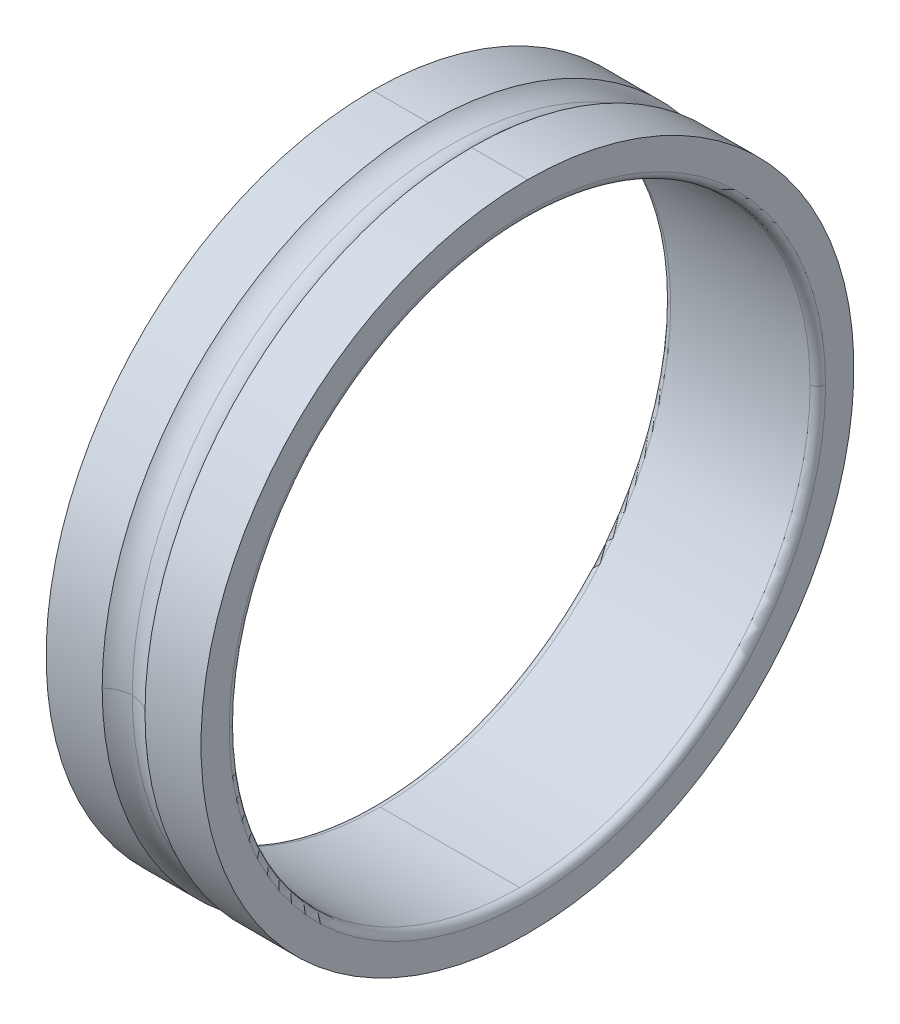
ISO-10303-21;
HEADER;
FILE_DESCRIPTION(('STEP AP214'),'2;1');
FILE_NAME('part.step','',(''),(''),'','','');
FILE_SCHEMA(('AUTOMOTIVE_DESIGN { 1 0 10303 214 1 1 1 1 }'));
ENDSEC;
DATA;
#1=APPLICATION_CONTEXT('core data for automotive mechanical design processes');
#2=APPLICATION_PROTOCOL_DEFINITION('international standard','automotive_design',2000,#1);
#3=PRODUCT_CONTEXT('',#1,'mechanical');
#4=PRODUCT('Part','Part','',(#3));
#5=PRODUCT_RELATED_PRODUCT_CATEGORY('part','',(#4));
#6=PRODUCT_DEFINITION_FORMATION('','',#4);
#7=PRODUCT_DEFINITION_CONTEXT('part definition',#1,'design');
#8=PRODUCT_DEFINITION('design','',#6,#7);
#9=PRODUCT_DEFINITION_SHAPE('','',#8);
#10=(LENGTH_UNIT() NAMED_UNIT(*) SI_UNIT(.MILLI.,.METRE.));
#11=(NAMED_UNIT(*) PLANE_ANGLE_UNIT() SI_UNIT($,.RADIAN.));
#12=(NAMED_UNIT(*) SI_UNIT($,.STERADIAN.) SOLID_ANGLE_UNIT());
#13=UNCERTAINTY_MEASURE_WITH_UNIT(LENGTH_MEASURE(1.E-05),#10,'distance_accuracy_value','');
#14=(GEOMETRIC_REPRESENTATION_CONTEXT(3) GLOBAL_UNCERTAINTY_ASSIGNED_CONTEXT((#13)) GLOBAL_UNIT_ASSIGNED_CONTEXT((#10,
#11,#12)) REPRESENTATION_CONTEXT('',''));
#15=CARTESIAN_POINT('',(0.,0.,0.));
#16=DIRECTION('',(0.,0.,1.));
#17=DIRECTION('',(1.,0.,0.));
#18=AXIS2_PLACEMENT_3D('',#15,#16,#17);
#19=CARTESIAN_POINT('',(3.276376554722,0.,0.));
#20=DIRECTION('',(1.,0.,0.));
#21=DIRECTION('',(0.,1.,0.));
#22=AXIS2_PLACEMENT_3D('',#19,#20,#21);
#23=CYLINDRICAL_SURFACE('',#22,8.43);
#24=DIRECTION('',(1.,0.,0.));
#25=VECTOR('',#24,1.);
#26=CARTESIAN_POINT('',(3.276376554722,8.43,0.));
#27=LINE('',#26,#25);
#28=CARTESIAN_POINT('',(2.552753109444,8.43,0.));
#29=VERTEX_POINT('',#28);
#30=CARTESIAN_POINT('',(4.,8.43,0.));
#31=VERTEX_POINT('',#30);
#32=EDGE_CURVE('E183',#29,#31,#27,.T.);
#33=ORIENTED_EDGE('',*,*,#32,.T.);
#34=CARTESIAN_POINT('',(4.,0.,0.));
#35=DIRECTION('',(1.,0.,0.));
#36=DIRECTION('',(0.,1.,0.));
#37=AXIS2_PLACEMENT_3D('',#34,#35,#36);
#38=CIRCLE('',#37,8.43);
#39=CARTESIAN_POINT('',(4.,-8.43,0.));
#40=VERTEX_POINT('',#39);
#41=EDGE_CURVE('E137',#40,#31,#38,.T.);
#42=ORIENTED_EDGE('',*,*,#41,.F.);
#43=DIRECTION('',(-1.,0.,0.));
#44=VECTOR('',#43,1.);
#45=CARTESIAN_POINT('',(3.276376554722,-8.43,0.));
#46=LINE('',#45,#44);
#47=CARTESIAN_POINT('',(2.552753109444,-8.43,0.));
#48=VERTEX_POINT('',#47);
#49=EDGE_CURVE('E191',#40,#48,#46,.T.);
#50=ORIENTED_EDGE('',*,*,#49,.T.);
#51=CARTESIAN_POINT('',(2.552753109444,0.,0.));
#52=DIRECTION('',(1.,0.,0.));
#53=DIRECTION('',(0.,1.,0.));
#54=AXIS2_PLACEMENT_3D('',#51,#52,#53);
#55=CIRCLE('',#54,8.43);
#56=CARTESIAN_POINT('',(2.552753109444,0.,-8.43));
#57=VERTEX_POINT('',#56);
#58=EDGE_CURVE('E174',#48,#57,#55,.T.);
#59=ORIENTED_EDGE('',*,*,#58,.T.);
#60=CARTESIAN_POINT('',(2.552753109444,0.,0.));
#61=DIRECTION('',(1.,0.,0.));
#62=DIRECTION('',(0.,1.,0.));
#63=AXIS2_PLACEMENT_3D('',#60,#61,#62);
#64=CIRCLE('',#63,8.43);
#65=EDGE_CURVE('E180',#57,#29,#64,.T.);
#66=ORIENTED_EDGE('',*,*,#65,.T.);
#67=EDGE_LOOP('',(#33,#42,#50,#59,#66));
#68=FACE_BOUND('',#67,.T.);
#69=ADVANCED_FACE('F16',(#68),#23,.T.);
#70=CARTESIAN_POINT('',(2.,0.,0.));
#71=DIRECTION('',(1.,0.,0.));
#72=DIRECTION('',(0.,0.,-1.));
#73=AXIS2_PLACEMENT_3D('',#70,#71,#72);
#74=TOROIDAL_SURFACE('',#73,9.,0.794);
#75=CARTESIAN_POINT('',(2.,0.,0.));
#76=DIRECTION('',(-1.,0.,0.));
#77=DIRECTION('',(0.,0.,1.));
#78=AXIS2_PLACEMENT_3D('',#75,#76,#77);
#79=CIRCLE('',#78,8.206);
#80=CARTESIAN_POINT('',(2.,0.,8.206));
#81=VERTEX_POINT('',#80);
#82=CARTESIAN_POINT('',(2.,0.,-8.206));
#83=VERTEX_POINT('',#82);
#84=EDGE_CURVE('E167',#81,#83,#79,.T.);
#85=ORIENTED_EDGE('',*,*,#84,.T.);
#86=CARTESIAN_POINT('',(2.,0.,-9.));
#87=DIRECTION('',(0.,-1.,0.));
#88=DIRECTION('',(0.,0.,-1.));
#89=AXIS2_PLACEMENT_3D('',#86,#87,#88);
#90=CIRCLE('',#89,0.794);
#91=CARTESIAN_POINT('',(1.447246890556,0.,-8.43));
#92=VERTEX_POINT('',#91);
#93=EDGE_CURVE('E160',#83,#92,#90,.T.);
#94=ORIENTED_EDGE('',*,*,#93,.T.);
#95=CARTESIAN_POINT('',(1.447246890556,0.,0.));
#96=DIRECTION('',(1.,0.,0.));
#97=DIRECTION('',(0.,1.,0.));
#98=AXIS2_PLACEMENT_3D('',#95,#96,#97);
#99=CIRCLE('',#98,8.43);
#100=CARTESIAN_POINT('',(1.447246890556,8.43,0.));
#101=VERTEX_POINT('',#100);
#102=EDGE_CURVE('E11',#92,#101,#99,.T.);
#103=ORIENTED_EDGE('',*,*,#102,.T.);
#104=CARTESIAN_POINT('',(1.447246890556,0.,0.));
#105=DIRECTION('',(1.,0.,0.));
#106=DIRECTION('',(0.,1.,0.));
#107=AXIS2_PLACEMENT_3D('',#104,#105,#106);
#108=CIRCLE('',#107,8.43);
#109=CARTESIAN_POINT('',(1.447246890556,0.,8.43));
#110=VERTEX_POINT('',#109);
#111=EDGE_CURVE('E159',#101,#110,#108,.T.);
#112=ORIENTED_EDGE('',*,*,#111,.T.);
#113=CARTESIAN_POINT('',(2.,0.,9.));
#114=DIRECTION('',(0.,-1.,0.));
#115=DIRECTION('',(0.,0.,1.));
#116=AXIS2_PLACEMENT_3D('',#113,#114,#115);
#117=CIRCLE('',#116,0.794);
#118=EDGE_CURVE('E201',#110,#81,#117,.T.);
#119=ORIENTED_EDGE('',*,*,#118,.T.);
#120=EDGE_LOOP('',(#85,#94,#103,#112,#119));
#121=FACE_BOUND('',#120,.T.);
#122=ADVANCED_FACE('F259',(#121),#74,.F.);
#123=CARTESIAN_POINT('',(0.723623445278001,0.,0.));
#124=DIRECTION('',(1.,0.,0.));
#125=DIRECTION('',(0.,1.,0.));
#126=AXIS2_PLACEMENT_3D('',#123,#124,#125);
#127=CYLINDRICAL_SURFACE('',#126,8.43);
#128=DIRECTION('',(1.,0.,0.));
#129=VECTOR('',#128,1.);
#130=CARTESIAN_POINT('',(0.723623445278001,8.43,0.));
#131=LINE('',#130,#129);
#132=CARTESIAN_POINT('',(0.,8.43,0.));
#133=VERTEX_POINT('',#132);
#134=EDGE_CURVE('E148',#133,#101,#131,.T.);
#135=ORIENTED_EDGE('',*,*,#134,.T.);
#136=ORIENTED_EDGE('',*,*,#102,.F.);
#137=CARTESIAN_POINT('',(1.447246890556,0.,0.));
#138=DIRECTION('',(1.,0.,0.));
#139=DIRECTION('',(0.,1.,0.));
#140=AXIS2_PLACEMENT_3D('',#137,#138,#139);
#141=CIRCLE('',#140,8.43);
#142=CARTESIAN_POINT('',(1.447246890556,-8.43,0.));
#143=VERTEX_POINT('',#142);
#144=EDGE_CURVE('E163',#143,#92,#141,.T.);
#145=ORIENTED_EDGE('',*,*,#144,.F.);
#146=DIRECTION('',(-1.,0.,0.));
#147=VECTOR('',#146,1.);
#148=CARTESIAN_POINT('',(0.723623445278001,-8.43,0.));
#149=LINE('',#148,#147);
#150=CARTESIAN_POINT('',(0.,-8.43,0.));
#151=VERTEX_POINT('',#150);
#152=EDGE_CURVE('E150',#143,#151,#149,.T.);
#153=ORIENTED_EDGE('',*,*,#152,.T.);
#154=CARTESIAN_POINT('',(0.,0.,0.));
#155=DIRECTION('',(1.,0.,0.));
#156=DIRECTION('',(0.,1.,0.));
#157=AXIS2_PLACEMENT_3D('',#154,#155,#156);
#158=CIRCLE('',#157,8.43);
#159=EDGE_CURVE('E24',#151,#133,#158,.T.);
#160=ORIENTED_EDGE('',*,*,#159,.T.);
#161=EDGE_LOOP('',(#135,#136,#145,#153,#160));
#162=FACE_BOUND('',#161,.T.);
#163=ADVANCED_FACE('F146',(#162),#127,.T.);
#164=CARTESIAN_POINT('',(0.,8.065,0.));
#165=DIRECTION('',(-1.,0.,0.));
#166=DIRECTION('',(0.,0.,1.));
#167=AXIS2_PLACEMENT_3D('',#164,#165,#166);
#168=PLANE('',#167);
#169=CARTESIAN_POINT('',(0.,0.,0.));
#170=DIRECTION('',(1.,0.,0.));
#171=DIRECTION('',(0.,1.,0.));
#172=AXIS2_PLACEMENT_3D('',#169,#170,#171);
#173=CIRCLE('',#172,7.7);
#174=CARTESIAN_POINT('',(0.,0.,7.7));
#175=VERTEX_POINT('',#174);
#176=CARTESIAN_POINT('',(0.,0.,-7.7));
#177=VERTEX_POINT('',#176);
#178=EDGE_CURVE('E140',#175,#177,#173,.T.);
#179=ORIENTED_EDGE('',*,*,#178,.T.);
#180=CARTESIAN_POINT('',(0.,0.,0.));
#181=DIRECTION('',(1.,0.,0.));
#182=DIRECTION('',(0.,1.,0.));
#183=AXIS2_PLACEMENT_3D('',#180,#181,#182);
#184=CIRCLE('',#183,7.7);
#185=EDGE_CURVE('E222',#177,#175,#184,.T.);
#186=ORIENTED_EDGE('',*,*,#185,.T.);
#187=EDGE_LOOP('',(#179,#186));
#188=FACE_BOUND('',#187,.T.);
#189=CARTESIAN_POINT('',(0.,0.,0.));
#190=DIRECTION('',(1.,0.,0.));
#191=DIRECTION('',(0.,1.,0.));
#192=AXIS2_PLACEMENT_3D('',#189,#190,#191);
#193=CIRCLE('',#192,8.43);
#194=EDGE_CURVE('E153',#133,#151,#193,.T.);
#195=ORIENTED_EDGE('',*,*,#194,.F.);
#196=ORIENTED_EDGE('',*,*,#159,.F.);
#197=EDGE_LOOP('',(#195,#196));
#198=FACE_BOUND('',#197,.T.);
#199=ADVANCED_FACE('F18',(#188,#198),#168,.T.);
#200=CARTESIAN_POINT('',(0.2,0.,0.));
#201=DIRECTION('',(1.,0.,0.));
#202=DIRECTION('',(0.,0.,-1.));
#203=AXIS2_PLACEMENT_3D('',#200,#201,#202);
#204=TOROIDAL_SURFACE('',#203,7.7,0.2);
#205=CARTESIAN_POINT('',(0.2,0.,-7.7));
#206=DIRECTION('',(0.,-1.,0.));
#207=DIRECTION('',(0.,0.,-1.));
#208=AXIS2_PLACEMENT_3D('',#205,#206,#207);
#209=CIRCLE('',#208,0.2);
#210=CARTESIAN_POINT('',(0.2,0.,-7.5));
#211=VERTEX_POINT('',#210);
#212=EDGE_CURVE('E210',#211,#177,#209,.T.);
#213=ORIENTED_EDGE('',*,*,#212,.T.);
#214=ORIENTED_EDGE('',*,*,#178,.F.);
#215=CARTESIAN_POINT('',(0.2,0.,7.7));
#216=DIRECTION('',(0.,-1.,0.));
#217=DIRECTION('',(0.,0.,1.));
#218=AXIS2_PLACEMENT_3D('',#215,#216,#217);
#219=CIRCLE('',#218,0.2);
#220=CARTESIAN_POINT('',(0.2,0.,7.5));
#221=VERTEX_POINT('',#220);
#222=EDGE_CURVE('E219',#175,#221,#219,.T.);
#223=ORIENTED_EDGE('',*,*,#222,.T.);
#224=CARTESIAN_POINT('',(0.2,0.,0.));
#225=DIRECTION('',(1.,0.,0.));
#226=DIRECTION('',(0.,1.,0.));
#227=AXIS2_PLACEMENT_3D('',#224,#225,#226);
#228=CIRCLE('',#227,7.5);
#229=CARTESIAN_POINT('',(0.2,-7.5,0.));
#230=VERTEX_POINT('',#229);
#231=EDGE_CURVE('E138',#221,#230,#228,.T.);
#232=ORIENTED_EDGE('',*,*,#231,.T.);
#233=CARTESIAN_POINT('',(0.2,0.,0.));
#234=DIRECTION('',(1.,0.,0.));
#235=DIRECTION('',(0.,1.,0.));
#236=AXIS2_PLACEMENT_3D('',#233,#234,#235);
#237=CIRCLE('',#236,7.5);
#238=EDGE_CURVE('E130',#230,#211,#237,.T.);
#239=ORIENTED_EDGE('',*,*,#238,.T.);
#240=EDGE_LOOP('',(#213,#214,#223,#232,#239));
#241=FACE_BOUND('',#240,.T.);
#242=ADVANCED_FACE('F228',(#241),#204,.T.);
#243=CARTESIAN_POINT('',(2.,0.,0.));
#244=DIRECTION('',(1.,0.,0.));
#245=DIRECTION('',(0.,1.,0.));
#246=AXIS2_PLACEMENT_3D('',#243,#244,#245);
#247=CYLINDRICAL_SURFACE('',#246,7.5);
#248=DIRECTION('',(1.,0.,0.));
#249=VECTOR('',#248,1.);
#250=CARTESIAN_POINT('',(2.,7.5,0.));
#251=LINE('',#250,#249);
#252=CARTESIAN_POINT('',(0.2,7.5,0.));
#253=VERTEX_POINT('',#252);
#254=CARTESIAN_POINT('',(3.8,7.5,0.));
#255=VERTEX_POINT('',#254);
#256=EDGE_CURVE('E225',#253,#255,#251,.T.);
#257=ORIENTED_EDGE('',*,*,#256,.T.);
#258=CARTESIAN_POINT('',(3.8,0.,0.));
#259=DIRECTION('',(1.,0.,0.));
#260=DIRECTION('',(0.,1.,0.));
#261=AXIS2_PLACEMENT_3D('',#258,#259,#260);
#262=CIRCLE('',#261,7.5);
#263=CARTESIAN_POINT('',(3.8,0.,7.5));
#264=VERTEX_POINT('',#263);
#265=EDGE_CURVE('E121',#255,#264,#262,.T.);
#266=ORIENTED_EDGE('',*,*,#265,.T.);
#267=CARTESIAN_POINT('',(3.8,0.,0.));
#268=DIRECTION('',(1.,0.,0.));
#269=DIRECTION('',(0.,1.,0.));
#270=AXIS2_PLACEMENT_3D('',#267,#268,#269);
#271=CIRCLE('',#270,7.5);
#272=CARTESIAN_POINT('',(3.8,-7.5,0.));
#273=VERTEX_POINT('',#272);
#274=EDGE_CURVE('E31',#264,#273,#271,.T.);
#275=ORIENTED_EDGE('',*,*,#274,.T.);
#276=DIRECTION('',(-1.,0.,0.));
#277=VECTOR('',#276,1.);
#278=CARTESIAN_POINT('',(2.,-7.5,0.));
#279=LINE('',#278,#277);
#280=EDGE_CURVE('E128',#273,#230,#279,.T.);
#281=ORIENTED_EDGE('',*,*,#280,.T.);
#282=ORIENTED_EDGE('',*,*,#231,.F.);
#283=CARTESIAN_POINT('',(0.2,0.,0.));
#284=DIRECTION('',(1.,0.,0.));
#285=DIRECTION('',(0.,1.,0.));
#286=AXIS2_PLACEMENT_3D('',#283,#284,#285);
#287=CIRCLE('',#286,7.5);
#288=EDGE_CURVE('E216',#253,#221,#287,.T.);
#289=ORIENTED_EDGE('',*,*,#288,.F.);
#290=EDGE_LOOP('',(#257,#266,#275,#281,#282,#289));
#291=FACE_BOUND('',#290,.T.);
#292=ADVANCED_FACE('F237',(#291),#247,.F.);
#293=CARTESIAN_POINT('',(3.8,0.,0.));
#294=DIRECTION('',(1.,0.,0.));
#295=DIRECTION('',(0.,0.,-1.));
#296=AXIS2_PLACEMENT_3D('',#293,#294,#295);
#297=TOROIDAL_SURFACE('',#296,7.7,0.2);
#298=CARTESIAN_POINT('',(3.8,0.,-7.7));
#299=DIRECTION('',(0.,-1.,0.));
#300=DIRECTION('',(0.,0.,-1.));
#301=AXIS2_PLACEMENT_3D('',#298,#299,#300);
#302=CIRCLE('',#301,0.2);
#303=CARTESIAN_POINT('',(4.,0.,-7.7));
#304=VERTEX_POINT('',#303);
#305=CARTESIAN_POINT('',(3.8,0.,-7.5));
#306=VERTEX_POINT('',#305);
#307=EDGE_CURVE('E107',#304,#306,#302,.T.);
#308=ORIENTED_EDGE('',*,*,#307,.T.);
#309=CARTESIAN_POINT('',(3.8,0.,0.));
#310=DIRECTION('',(1.,0.,0.));
#311=DIRECTION('',(0.,1.,0.));
#312=AXIS2_PLACEMENT_3D('',#309,#310,#311);
#313=CIRCLE('',#312,7.5);
#314=EDGE_CURVE('E111',#273,#306,#313,.T.);
#315=ORIENTED_EDGE('',*,*,#314,.F.);
#316=ORIENTED_EDGE('',*,*,#274,.F.);
#317=CARTESIAN_POINT('',(3.8,0.,7.7));
#318=DIRECTION('',(0.,-1.,0.));
#319=DIRECTION('',(0.,0.,1.));
#320=AXIS2_PLACEMENT_3D('',#317,#318,#319);
#321=CIRCLE('',#320,0.2);
#322=CARTESIAN_POINT('',(4.,0.,7.7));
#323=VERTEX_POINT('',#322);
#324=EDGE_CURVE('E134',#264,#323,#321,.T.);
#325=ORIENTED_EDGE('',*,*,#324,.T.);
#326=CARTESIAN_POINT('',(4.,0.,0.));
#327=DIRECTION('',(1.,0.,0.));
#328=DIRECTION('',(0.,1.,0.));
#329=AXIS2_PLACEMENT_3D('',#326,#327,#328);
#330=CIRCLE('',#329,7.7);
#331=EDGE_CURVE('E39',#323,#304,#330,.T.);
#332=ORIENTED_EDGE('',*,*,#331,.T.);
#333=EDGE_LOOP('',(#308,#315,#316,#325,#332));
#334=FACE_BOUND('',#333,.T.);
#335=ADVANCED_FACE('F109',(#334),#297,.T.);
#336=CARTESIAN_POINT('',(4.,8.065,0.));
#337=DIRECTION('',(1.,0.,0.));
#338=DIRECTION('',(0.,1.,0.));
#339=AXIS2_PLACEMENT_3D('',#336,#337,#338);
#340=PLANE('',#339);
#341=CARTESIAN_POINT('',(4.,0.,0.));
#342=DIRECTION('',(1.,0.,0.));
#343=DIRECTION('',(0.,1.,0.));
#344=AXIS2_PLACEMENT_3D('',#341,#342,#343);
#345=CIRCLE('',#344,7.7);
#346=EDGE_CURVE('E115',#304,#323,#345,.T.);
#347=ORIENTED_EDGE('',*,*,#346,.F.);
#348=ORIENTED_EDGE('',*,*,#331,.F.);
#349=EDGE_LOOP('',(#347,#348));
#350=FACE_BOUND('',#349,.T.);
#351=CARTESIAN_POINT('',(4.,0.,0.));
#352=DIRECTION('',(1.,0.,0.));
#353=DIRECTION('',(0.,1.,0.));
#354=AXIS2_PLACEMENT_3D('',#351,#352,#353);
#355=CIRCLE('',#354,8.43);
#356=EDGE_CURVE('E193',#31,#40,#355,.T.);
#357=ORIENTED_EDGE('',*,*,#356,.T.);
#358=ORIENTED_EDGE('',*,*,#41,.T.);
#359=EDGE_LOOP('',(#357,#358));
#360=FACE_BOUND('',#359,.T.);
#361=ADVANCED_FACE('F238',(#350,#360),#340,.T.);
#362=CARTESIAN_POINT('',(3.8,0.,0.));
#363=DIRECTION('',(1.,0.,0.));
#364=DIRECTION('',(0.,0.,-1.));
#365=AXIS2_PLACEMENT_3D('',#362,#363,#364);
#366=TOROIDAL_SURFACE('',#365,7.7,0.2);
#367=ORIENTED_EDGE('',*,*,#307,.F.);
#368=ORIENTED_EDGE('',*,*,#346,.T.);
#369=ORIENTED_EDGE('',*,*,#324,.F.);
#370=ORIENTED_EDGE('',*,*,#265,.F.);
#371=CARTESIAN_POINT('',(3.8,0.,0.));
#372=DIRECTION('',(1.,0.,0.));
#373=DIRECTION('',(0.,1.,0.));
#374=AXIS2_PLACEMENT_3D('',#371,#372,#373);
#375=CIRCLE('',#374,7.5);
#376=EDGE_CURVE('E116',#306,#255,#375,.T.);
#377=ORIENTED_EDGE('',*,*,#376,.F.);
#378=EDGE_LOOP('',(#367,#368,#369,#370,#377));
#379=FACE_BOUND('',#378,.T.);
#380=ADVANCED_FACE('F119',(#379),#366,.T.);
#381=CARTESIAN_POINT('',(2.,0.,0.));
#382=DIRECTION('',(1.,0.,0.));
#383=DIRECTION('',(0.,1.,0.));
#384=AXIS2_PLACEMENT_3D('',#381,#382,#383);
#385=CYLINDRICAL_SURFACE('',#384,7.5);
#386=ORIENTED_EDGE('',*,*,#256,.F.);
#387=CARTESIAN_POINT('',(0.2,0.,0.));
#388=DIRECTION('',(1.,0.,0.));
#389=DIRECTION('',(0.,1.,0.));
#390=AXIS2_PLACEMENT_3D('',#387,#388,#389);
#391=CIRCLE('',#390,7.5);
#392=EDGE_CURVE('E213',#211,#253,#391,.T.);
#393=ORIENTED_EDGE('',*,*,#392,.F.);
#394=ORIENTED_EDGE('',*,*,#238,.F.);
#395=ORIENTED_EDGE('',*,*,#280,.F.);
#396=ORIENTED_EDGE('',*,*,#314,.T.);
#397=ORIENTED_EDGE('',*,*,#376,.T.);
#398=EDGE_LOOP('',(#386,#393,#394,#395,#396,#397));
#399=FACE_BOUND('',#398,.T.);
#400=ADVANCED_FACE('F125',(#399),#385,.F.);
#401=CARTESIAN_POINT('',(0.2,0.,0.));
#402=DIRECTION('',(1.,0.,0.));
#403=DIRECTION('',(0.,0.,-1.));
#404=AXIS2_PLACEMENT_3D('',#401,#402,#403);
#405=TOROIDAL_SURFACE('',#404,7.7,0.2);
#406=ORIENTED_EDGE('',*,*,#212,.F.);
#407=ORIENTED_EDGE('',*,*,#392,.T.);
#408=ORIENTED_EDGE('',*,*,#288,.T.);
#409=ORIENTED_EDGE('',*,*,#222,.F.);
#410=ORIENTED_EDGE('',*,*,#185,.F.);
#411=EDGE_LOOP('',(#406,#407,#408,#409,#410));
#412=FACE_BOUND('',#411,.T.);
#413=ADVANCED_FACE('F233',(#412),#405,.T.);
#414=CARTESIAN_POINT('',(0.723623445278001,0.,0.));
#415=DIRECTION('',(1.,0.,0.));
#416=DIRECTION('',(0.,1.,0.));
#417=AXIS2_PLACEMENT_3D('',#414,#415,#416);
#418=CYLINDRICAL_SURFACE('',#417,8.43);
#419=ORIENTED_EDGE('',*,*,#134,.F.);
#420=ORIENTED_EDGE('',*,*,#194,.T.);
#421=ORIENTED_EDGE('',*,*,#152,.F.);
#422=CARTESIAN_POINT('',(1.447246890556,0.,0.));
#423=DIRECTION('',(1.,0.,0.));
#424=DIRECTION('',(0.,1.,0.));
#425=AXIS2_PLACEMENT_3D('',#422,#423,#424);
#426=CIRCLE('',#425,8.43);
#427=EDGE_CURVE('E203',#110,#143,#426,.T.);
#428=ORIENTED_EDGE('',*,*,#427,.F.);
#429=ORIENTED_EDGE('',*,*,#111,.F.);
#430=EDGE_LOOP('',(#419,#420,#421,#428,#429));
#431=FACE_BOUND('',#430,.T.);
#432=ADVANCED_FACE('F157',(#431),#418,.T.);
#433=CARTESIAN_POINT('',(2.,0.,0.));
#434=DIRECTION('',(1.,0.,0.));
#435=DIRECTION('',(0.,0.,-1.));
#436=AXIS2_PLACEMENT_3D('',#433,#434,#435);
#437=TOROIDAL_SURFACE('',#436,9.,0.794);
#438=CARTESIAN_POINT('',(2.,0.,0.));
#439=DIRECTION('',(-1.,0.,0.));
#440=DIRECTION('',(0.,0.,1.));
#441=AXIS2_PLACEMENT_3D('',#438,#439,#440);
#442=CIRCLE('',#441,8.206);
#443=EDGE_CURVE('E177',#83,#81,#442,.T.);
#444=ORIENTED_EDGE('',*,*,#443,.T.);
#445=ORIENTED_EDGE('',*,*,#118,.F.);
#446=ORIENTED_EDGE('',*,*,#427,.T.);
#447=ORIENTED_EDGE('',*,*,#144,.T.);
#448=ORIENTED_EDGE('',*,*,#93,.F.);
#449=EDGE_LOOP('',(#444,#445,#446,#447,#448));
#450=FACE_BOUND('',#449,.T.);
#451=ADVANCED_FACE('F262',(#450),#437,.F.);
#452=CARTESIAN_POINT('',(3.276376554722,0.,0.));
#453=DIRECTION('',(1.,0.,0.));
#454=DIRECTION('',(0.,1.,0.));
#455=AXIS2_PLACEMENT_3D('',#452,#453,#454);
#456=CYLINDRICAL_SURFACE('',#455,8.43);
#457=ORIENTED_EDGE('',*,*,#32,.F.);
#458=CARTESIAN_POINT('',(2.552753109444,0.,0.));
#459=DIRECTION('',(1.,0.,0.));
#460=DIRECTION('',(0.,1.,0.));
#461=AXIS2_PLACEMENT_3D('',#458,#459,#460);
#462=CIRCLE('',#461,8.43);
#463=CARTESIAN_POINT('',(2.552753109444,0.,8.43));
#464=VERTEX_POINT('',#463);
#465=EDGE_CURVE('E173',#29,#464,#462,.T.);
#466=ORIENTED_EDGE('',*,*,#465,.T.);
#467=CARTESIAN_POINT('',(2.552753109444,0.,0.));
#468=DIRECTION('',(1.,0.,0.));
#469=DIRECTION('',(0.,1.,0.));
#470=AXIS2_PLACEMENT_3D('',#467,#468,#469);
#471=CIRCLE('',#470,8.43);
#472=EDGE_CURVE('E176',#464,#48,#471,.T.);
#473=ORIENTED_EDGE('',*,*,#472,.T.);
#474=ORIENTED_EDGE('',*,*,#49,.F.);
#475=ORIENTED_EDGE('',*,*,#356,.F.);
#476=EDGE_LOOP('',(#457,#466,#473,#474,#475));
#477=FACE_BOUND('',#476,.T.);
#478=ADVANCED_FACE('F245',(#477),#456,.T.);
#479=CARTESIAN_POINT('',(2.,0.,0.));
#480=DIRECTION('',(1.,0.,0.));
#481=DIRECTION('',(0.,0.,-1.));
#482=AXIS2_PLACEMENT_3D('',#479,#480,#481);
#483=TOROIDAL_SURFACE('',#482,9.,0.794);
#484=ORIENTED_EDGE('',*,*,#443,.F.);
#485=CARTESIAN_POINT('',(2.,0.,-9.));
#486=DIRECTION('',(0.,-1.,0.));
#487=DIRECTION('',(0.,0.,-1.));
#488=AXIS2_PLACEMENT_3D('',#485,#486,#487);
#489=CIRCLE('',#488,0.794);
#490=EDGE_CURVE('E187',#57,#83,#489,.T.);
#491=ORIENTED_EDGE('',*,*,#490,.F.);
#492=ORIENTED_EDGE('',*,*,#58,.F.);
#493=ORIENTED_EDGE('',*,*,#472,.F.);
#494=CARTESIAN_POINT('',(2.,0.,9.));
#495=DIRECTION('',(0.,-1.,0.));
#496=DIRECTION('',(0.,0.,1.));
#497=AXIS2_PLACEMENT_3D('',#494,#495,#496);
#498=CIRCLE('',#497,0.794);
#499=EDGE_CURVE('E170',#81,#464,#498,.T.);
#500=ORIENTED_EDGE('',*,*,#499,.F.);
#501=EDGE_LOOP('',(#484,#491,#492,#493,#500));
#502=FACE_BOUND('',#501,.T.);
#503=ADVANCED_FACE('F257',(#502),#483,.F.);
#504=CARTESIAN_POINT('',(2.,0.,0.));
#505=DIRECTION('',(1.,0.,0.));
#506=DIRECTION('',(0.,0.,-1.));
#507=AXIS2_PLACEMENT_3D('',#504,#505,#506);
#508=TOROIDAL_SURFACE('',#507,9.,0.794);
#509=ORIENTED_EDGE('',*,*,#84,.F.);
#510=ORIENTED_EDGE('',*,*,#499,.T.);
#511=ORIENTED_EDGE('',*,*,#465,.F.);
#512=ORIENTED_EDGE('',*,*,#65,.F.);
#513=ORIENTED_EDGE('',*,*,#490,.T.);
#514=EDGE_LOOP('',(#509,#510,#511,#512,#513));
#515=FACE_BOUND('',#514,.T.);
#516=ADVANCED_FACE('F254',(#515),#508,.F.);
#517=CLOSED_SHELL('',(#69,#122,#163,#199,#242,#292,#335,#361,#380,#400,#413,#432,#451,#478,#503,#516));
#518=MANIFOLD_SOLID_BREP('B1',#517);
#519=ADVANCED_BREP_SHAPE_REPRESENTATION('',(#18,#518),#14);
#520=SHAPE_DEFINITION_REPRESENTATION(#9,#519);
ENDSEC;
END-ISO-10303-21;
